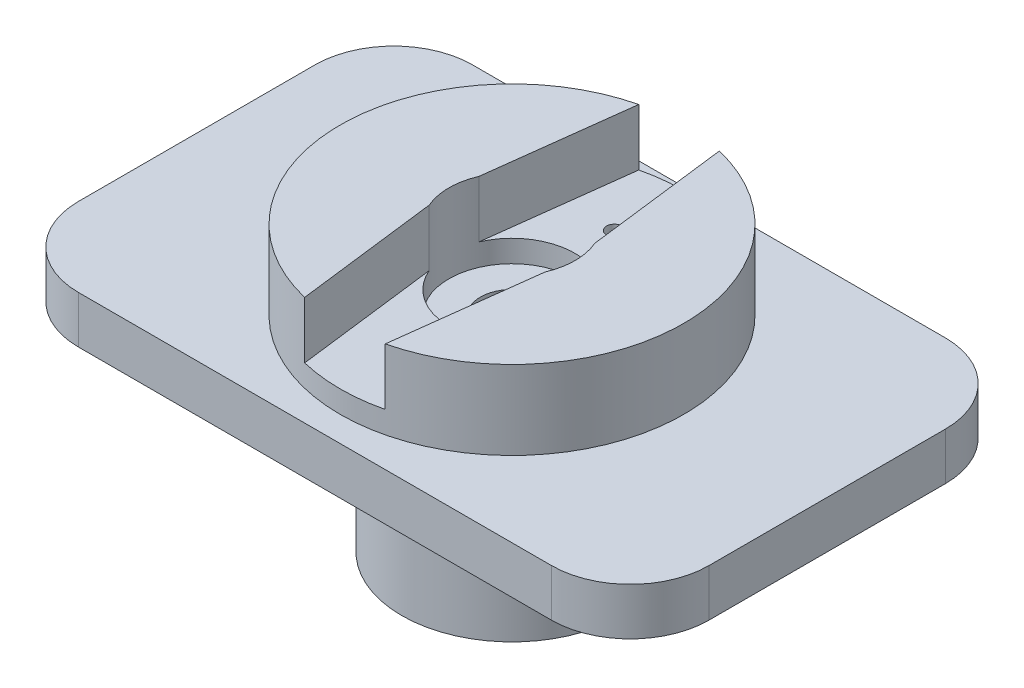
ISO-10303-21;
HEADER;
FILE_DESCRIPTION(('STEP AP214'),'2;1');
FILE_NAME('part.step','',(''),(''),'','','');
FILE_SCHEMA(('AUTOMOTIVE_DESIGN { 1 0 10303 214 1 1 1 1 }'));
ENDSEC;
DATA;
#1=APPLICATION_CONTEXT('core data for automotive mechanical design processes');
#2=APPLICATION_PROTOCOL_DEFINITION('international standard','automotive_design',2000,#1);
#3=PRODUCT_CONTEXT('',#1,'mechanical');
#4=PRODUCT('Part','Part','',(#3));
#5=PRODUCT_RELATED_PRODUCT_CATEGORY('part','',(#4));
#6=PRODUCT_DEFINITION_FORMATION('','',#4);
#7=PRODUCT_DEFINITION_CONTEXT('part definition',#1,'design');
#8=PRODUCT_DEFINITION('design','',#6,#7);
#9=PRODUCT_DEFINITION_SHAPE('','',#8);
#10=(LENGTH_UNIT() NAMED_UNIT(*) SI_UNIT(.MILLI.,.METRE.));
#11=(NAMED_UNIT(*) PLANE_ANGLE_UNIT() SI_UNIT($,.RADIAN.));
#12=(NAMED_UNIT(*) SI_UNIT($,.STERADIAN.) SOLID_ANGLE_UNIT());
#13=UNCERTAINTY_MEASURE_WITH_UNIT(LENGTH_MEASURE(1.E-05),#10,'distance_accuracy_value','');
#14=(GEOMETRIC_REPRESENTATION_CONTEXT(3) GLOBAL_UNCERTAINTY_ASSIGNED_CONTEXT((#13)) GLOBAL_UNIT_ASSIGNED_CONTEXT((#10,
#11,#12)) REPRESENTATION_CONTEXT('',''));
#15=CARTESIAN_POINT('',(0.,0.,0.));
#16=DIRECTION('',(0.,0.,1.));
#17=DIRECTION('',(1.,0.,0.));
#18=AXIS2_PLACEMENT_3D('',#15,#16,#17);
#19=CARTESIAN_POINT('',(15.,3.,-7.5));
#20=DIRECTION('',(0.,1.,0.));
#21=DIRECTION('',(0.,0.,1.));
#22=AXIS2_PLACEMENT_3D('',#19,#20,#21);
#23=CYLINDRICAL_SURFACE('',#22,5.);
#24=DIRECTION('',(0.,1.,0.));
#25=VECTOR('',#24,1.);
#26=CARTESIAN_POINT('',(20.,3.,-7.5));
#27=LINE('',#26,#25);
#28=CARTESIAN_POINT('',(20.,0.,-7.5));
#29=VERTEX_POINT('',#28);
#30=CARTESIAN_POINT('',(20.,3.,-7.5));
#31=VERTEX_POINT('',#30);
#32=EDGE_CURVE('E272',#29,#31,#27,.T.);
#33=ORIENTED_EDGE('',*,*,#32,.F.);
#34=CARTESIAN_POINT('',(15.,0.,-7.5));
#35=DIRECTION('',(0.,1.,0.));
#36=DIRECTION('',(0.,0.,1.));
#37=AXIS2_PLACEMENT_3D('',#34,#35,#36);
#38=CIRCLE('',#37,5.);
#39=CARTESIAN_POINT('',(15.,0.,-12.5));
#40=VERTEX_POINT('',#39);
#41=EDGE_CURVE('E59',#40,#29,#38,.F.);
#42=ORIENTED_EDGE('',*,*,#41,.F.);
#43=DIRECTION('',(0.,1.,0.));
#44=VECTOR('',#43,1.);
#45=CARTESIAN_POINT('',(15.,3.,-12.5));
#46=LINE('',#45,#44);
#47=CARTESIAN_POINT('',(15.,3.,-12.5));
#48=VERTEX_POINT('',#47);
#49=EDGE_CURVE('E275',#48,#40,#46,.F.);
#50=ORIENTED_EDGE('',*,*,#49,.F.);
#51=CARTESIAN_POINT('',(15.,3.,-7.5));
#52=DIRECTION('',(0.,1.,0.));
#53=DIRECTION('',(0.,0.,1.));
#54=AXIS2_PLACEMENT_3D('',#51,#52,#53);
#55=CIRCLE('',#54,5.);
#56=EDGE_CURVE('E46',#31,#48,#55,.T.);
#57=ORIENTED_EDGE('',*,*,#56,.F.);
#58=EDGE_LOOP('',(#33,#42,#50,#57));
#59=FACE_BOUND('',#58,.T.);
#60=ADVANCED_FACE('F39',(#59),#23,.T.);
#61=CARTESIAN_POINT('',(-15.,3.,-7.5));
#62=DIRECTION('',(0.,-1.,0.));
#63=DIRECTION('',(0.,0.,-1.));
#64=AXIS2_PLACEMENT_3D('',#61,#62,#63);
#65=CYLINDRICAL_SURFACE('',#64,5.);
#66=DIRECTION('',(0.,-1.,0.));
#67=VECTOR('',#66,1.);
#68=CARTESIAN_POINT('',(-20.,3.,-7.5));
#69=LINE('',#68,#67);
#70=CARTESIAN_POINT('',(-20.,3.,-7.5));
#71=VERTEX_POINT('',#70);
#72=CARTESIAN_POINT('',(-20.,0.,-7.5));
#73=VERTEX_POINT('',#72);
#74=EDGE_CURVE('E261',#71,#73,#69,.T.);
#75=ORIENTED_EDGE('',*,*,#74,.F.);
#76=CARTESIAN_POINT('',(-15.,3.,-7.5));
#77=DIRECTION('',(0.,1.,0.));
#78=DIRECTION('',(0.,0.,1.));
#79=AXIS2_PLACEMENT_3D('',#76,#77,#78);
#80=CIRCLE('',#79,5.);
#81=CARTESIAN_POINT('',(-15.,3.,-12.5));
#82=VERTEX_POINT('',#81);
#83=EDGE_CURVE('E267',#82,#71,#80,.T.);
#84=ORIENTED_EDGE('',*,*,#83,.F.);
#85=DIRECTION('',(0.,-1.,0.));
#86=VECTOR('',#85,1.);
#87=CARTESIAN_POINT('',(-15.,3.,-12.5));
#88=LINE('',#87,#86);
#89=CARTESIAN_POINT('',(-15.,0.,-12.5));
#90=VERTEX_POINT('',#89);
#91=EDGE_CURVE('E264',#90,#82,#88,.F.);
#92=ORIENTED_EDGE('',*,*,#91,.F.);
#93=CARTESIAN_POINT('',(-15.,0.,-7.5));
#94=DIRECTION('',(0.,1.,0.));
#95=DIRECTION('',(0.,0.,1.));
#96=AXIS2_PLACEMENT_3D('',#93,#94,#95);
#97=CIRCLE('',#96,5.);
#98=EDGE_CURVE('E269',#73,#90,#97,.F.);
#99=ORIENTED_EDGE('',*,*,#98,.F.);
#100=EDGE_LOOP('',(#75,#84,#92,#99));
#101=FACE_BOUND('',#100,.T.);
#102=ADVANCED_FACE('F306',(#101),#65,.T.);
#103=CARTESIAN_POINT('',(-15.,3.,7.5));
#104=DIRECTION('',(0.,-1.,0.));
#105=DIRECTION('',(0.,0.,-1.));
#106=AXIS2_PLACEMENT_3D('',#103,#104,#105);
#107=CYLINDRICAL_SURFACE('',#106,5.);
#108=DIRECTION('',(0.,-1.,0.));
#109=VECTOR('',#108,1.);
#110=CARTESIAN_POINT('',(-15.,3.,12.5));
#111=LINE('',#110,#109);
#112=CARTESIAN_POINT('',(-15.,3.,12.5));
#113=VERTEX_POINT('',#112);
#114=CARTESIAN_POINT('',(-15.,0.,12.5));
#115=VERTEX_POINT('',#114);
#116=EDGE_CURVE('E250',#113,#115,#111,.T.);
#117=ORIENTED_EDGE('',*,*,#116,.F.);
#118=CARTESIAN_POINT('',(-15.,3.,7.5));
#119=DIRECTION('',(0.,1.,0.));
#120=DIRECTION('',(0.,0.,1.));
#121=AXIS2_PLACEMENT_3D('',#118,#119,#120);
#122=CIRCLE('',#121,5.);
#123=CARTESIAN_POINT('',(-20.,3.,7.5));
#124=VERTEX_POINT('',#123);
#125=EDGE_CURVE('E256',#124,#113,#122,.T.);
#126=ORIENTED_EDGE('',*,*,#125,.F.);
#127=DIRECTION('',(0.,-1.,0.));
#128=VECTOR('',#127,1.);
#129=CARTESIAN_POINT('',(-20.,3.,7.5));
#130=LINE('',#129,#128);
#131=CARTESIAN_POINT('',(-20.,0.,7.5));
#132=VERTEX_POINT('',#131);
#133=EDGE_CURVE('E253',#132,#124,#130,.F.);
#134=ORIENTED_EDGE('',*,*,#133,.F.);
#135=CARTESIAN_POINT('',(-15.,0.,7.5));
#136=DIRECTION('',(0.,1.,0.));
#137=DIRECTION('',(0.,0.,1.));
#138=AXIS2_PLACEMENT_3D('',#135,#136,#137);
#139=CIRCLE('',#138,5.);
#140=EDGE_CURVE('E258',#115,#132,#139,.F.);
#141=ORIENTED_EDGE('',*,*,#140,.F.);
#142=EDGE_LOOP('',(#117,#126,#134,#141));
#143=FACE_BOUND('',#142,.T.);
#144=ADVANCED_FACE('F298',(#143),#107,.T.);
#145=CARTESIAN_POINT('',(15.,3.,7.5));
#146=DIRECTION('',(0.,-1.,0.));
#147=DIRECTION('',(0.,0.,-1.));
#148=AXIS2_PLACEMENT_3D('',#145,#146,#147);
#149=CYLINDRICAL_SURFACE('',#148,5.);
#150=DIRECTION('',(0.,-1.,0.));
#151=VECTOR('',#150,1.);
#152=CARTESIAN_POINT('',(20.,3.,7.5));
#153=LINE('',#152,#151);
#154=CARTESIAN_POINT('',(20.,3.,7.5));
#155=VERTEX_POINT('',#154);
#156=CARTESIAN_POINT('',(20.,0.,7.5));
#157=VERTEX_POINT('',#156);
#158=EDGE_CURVE('E161',#155,#157,#153,.T.);
#159=ORIENTED_EDGE('',*,*,#158,.F.);
#160=CARTESIAN_POINT('',(15.,3.,7.5));
#161=DIRECTION('',(0.,1.,0.));
#162=DIRECTION('',(0.,0.,1.));
#163=AXIS2_PLACEMENT_3D('',#160,#161,#162);
#164=CIRCLE('',#163,5.);
#165=CARTESIAN_POINT('',(15.,3.,12.5));
#166=VERTEX_POINT('',#165);
#167=EDGE_CURVE('E245',#166,#155,#164,.T.);
#168=ORIENTED_EDGE('',*,*,#167,.F.);
#169=DIRECTION('',(0.,-1.,0.));
#170=VECTOR('',#169,1.);
#171=CARTESIAN_POINT('',(15.,3.,12.5));
#172=LINE('',#171,#170);
#173=CARTESIAN_POINT('',(15.,0.,12.5));
#174=VERTEX_POINT('',#173);
#175=EDGE_CURVE('E242',#174,#166,#172,.F.);
#176=ORIENTED_EDGE('',*,*,#175,.F.);
#177=CARTESIAN_POINT('',(15.,0.,7.5));
#178=DIRECTION('',(0.,1.,0.));
#179=DIRECTION('',(0.,0.,1.));
#180=AXIS2_PLACEMENT_3D('',#177,#178,#179);
#181=CIRCLE('',#180,5.);
#182=EDGE_CURVE('E247',#157,#174,#181,.F.);
#183=ORIENTED_EDGE('',*,*,#182,.F.);
#184=EDGE_LOOP('',(#159,#168,#176,#183));
#185=FACE_BOUND('',#184,.T.);
#186=ADVANCED_FACE('F287',(#185),#149,.T.);
#187=CARTESIAN_POINT('',(0.,8.,0.));
#188=DIRECTION('',(0.,1.,0.));
#189=DIRECTION('',(0.,0.,1.));
#190=AXIS2_PLACEMENT_3D('',#187,#188,#189);
#191=PLANE('',#190);
#192=DIRECTION('',(-0.123207360520907,0.,0.992380948181429));
#193=VECTOR('',#192,1.);
#194=CARTESIAN_POINT('',(-3.67480993884706,8.,-1.57980122589865));
#195=LINE('',#194,#193);
#196=CARTESIAN_POINT('',(-2.55539130799865,8.,-10.5962245759046));
#197=VERTEX_POINT('',#196);
#198=CARTESIAN_POINT('',(-3.67480993884706,8.,-1.57980122589865));
#199=VERTEX_POINT('',#198);
#200=EDGE_CURVE('E170',#197,#199,#195,.T.);
#201=ORIENTED_EDGE('',*,*,#200,.F.);
#202=CARTESIAN_POINT('',(0.,8.,0.));
#203=DIRECTION('',(0.,1.,0.));
#204=DIRECTION('',(0.,0.,1.));
#205=AXIS2_PLACEMENT_3D('',#202,#203,#204);
#206=CIRCLE('',#205,10.9);
#207=CARTESIAN_POINT('',(-2.55539130799865,8.,10.5962245759046));
#208=VERTEX_POINT('',#207);
#209=EDGE_CURVE('E220',#197,#208,#206,.T.);
#210=ORIENTED_EDGE('',*,*,#209,.T.);
#211=DIRECTION('',(0.123207360520907,0.,0.992380948181429));
#212=VECTOR('',#211,1.);
#213=CARTESIAN_POINT('',(-3.67480993884706,8.,1.57980122589865));
#214=LINE('',#213,#212);
#215=CARTESIAN_POINT('',(-3.67480993884706,8.,1.57980122589865));
#216=VERTEX_POINT('',#215);
#217=EDGE_CURVE('E188',#216,#208,#214,.T.);
#218=ORIENTED_EDGE('',*,*,#217,.F.);
#219=CARTESIAN_POINT('',(0.,8.,0.));
#220=DIRECTION('',(0.,-1.,0.));
#221=DIRECTION('',(0.,0.,-1.));
#222=AXIS2_PLACEMENT_3D('',#219,#220,#221);
#223=CIRCLE('',#222,4.);
#224=EDGE_CURVE('E212',#216,#199,#223,.T.);
#225=ORIENTED_EDGE('',*,*,#224,.T.);
#226=EDGE_LOOP('',(#201,#210,#218,#225));
#227=FACE_BOUND('',#226,.T.);
#228=ADVANCED_FACE('F335',(#227),#191,.T.);
#229=CARTESIAN_POINT('',(20.,3.,-12.5));
#230=DIRECTION('',(-1.,0.,0.));
#231=DIRECTION('',(0.,0.,1.));
#232=AXIS2_PLACEMENT_3D('',#229,#230,#231);
#233=PLANE('',#232);
#234=DIRECTION('',(0.,0.,-1.));
#235=VECTOR('',#234,1.);
#236=CARTESIAN_POINT('',(20.,0.,-12.5));
#237=LINE('',#236,#235);
#238=EDGE_CURVE('E219',#157,#29,#237,.T.);
#239=ORIENTED_EDGE('',*,*,#238,.T.);
#240=ORIENTED_EDGE('',*,*,#32,.T.);
#241=DIRECTION('',(0.,0.,-1.));
#242=VECTOR('',#241,1.);
#243=CARTESIAN_POINT('',(20.,3.,-12.5));
#244=LINE('',#243,#242);
#245=EDGE_CURVE('E223',#155,#31,#244,.T.);
#246=ORIENTED_EDGE('',*,*,#245,.F.);
#247=ORIENTED_EDGE('',*,*,#158,.T.);
#248=EDGE_LOOP('',(#239,#240,#246,#247));
#249=FACE_BOUND('',#248,.T.);
#250=ADVANCED_FACE('F283',(#249),#233,.F.);
#251=CARTESIAN_POINT('',(-20.,3.,-12.5));
#252=DIRECTION('',(0.,0.,1.));
#253=DIRECTION('',(1.,0.,0.));
#254=AXIS2_PLACEMENT_3D('',#251,#252,#253);
#255=PLANE('',#254);
#256=DIRECTION('',(-1.,0.,0.));
#257=VECTOR('',#256,1.);
#258=CARTESIAN_POINT('',(-20.,3.,-12.5));
#259=LINE('',#258,#257);
#260=EDGE_CURVE('E225',#48,#82,#259,.T.);
#261=ORIENTED_EDGE('',*,*,#260,.F.);
#262=ORIENTED_EDGE('',*,*,#49,.T.);
#263=DIRECTION('',(-1.,0.,0.));
#264=VECTOR('',#263,1.);
#265=CARTESIAN_POINT('',(-20.,0.,-12.5));
#266=LINE('',#265,#264);
#267=EDGE_CURVE('E234',#40,#90,#266,.T.);
#268=ORIENTED_EDGE('',*,*,#267,.T.);
#269=ORIENTED_EDGE('',*,*,#91,.T.);
#270=EDGE_LOOP('',(#261,#262,#268,#269));
#271=FACE_BOUND('',#270,.T.);
#272=ADVANCED_FACE('F309',(#271),#255,.F.);
#273=CARTESIAN_POINT('',(-20.,3.,-12.5));
#274=DIRECTION('',(1.,0.,0.));
#275=DIRECTION('',(0.,0.,-1.));
#276=AXIS2_PLACEMENT_3D('',#273,#274,#275);
#277=PLANE('',#276);
#278=DIRECTION('',(0.,0.,1.));
#279=VECTOR('',#278,1.);
#280=CARTESIAN_POINT('',(-20.,3.,-12.5));
#281=LINE('',#280,#279);
#282=EDGE_CURVE('E228',#71,#124,#281,.T.);
#283=ORIENTED_EDGE('',*,*,#282,.F.);
#284=ORIENTED_EDGE('',*,*,#74,.T.);
#285=DIRECTION('',(0.,0.,1.));
#286=VECTOR('',#285,1.);
#287=CARTESIAN_POINT('',(-20.,0.,-12.5));
#288=LINE('',#287,#286);
#289=EDGE_CURVE('E236',#73,#132,#288,.T.);
#290=ORIENTED_EDGE('',*,*,#289,.T.);
#291=ORIENTED_EDGE('',*,*,#133,.T.);
#292=EDGE_LOOP('',(#283,#284,#290,#291));
#293=FACE_BOUND('',#292,.T.);
#294=ADVANCED_FACE('F301',(#293),#277,.F.);
#295=CARTESIAN_POINT('',(-20.,3.,12.5));
#296=DIRECTION('',(0.,0.,-1.));
#297=DIRECTION('',(-1.,0.,0.));
#298=AXIS2_PLACEMENT_3D('',#295,#296,#297);
#299=PLANE('',#298);
#300=DIRECTION('',(1.,0.,0.));
#301=VECTOR('',#300,1.);
#302=CARTESIAN_POINT('',(-20.,3.,12.5));
#303=LINE('',#302,#301);
#304=EDGE_CURVE('E230',#113,#166,#303,.T.);
#305=ORIENTED_EDGE('',*,*,#304,.F.);
#306=ORIENTED_EDGE('',*,*,#116,.T.);
#307=DIRECTION('',(1.,0.,0.));
#308=VECTOR('',#307,1.);
#309=CARTESIAN_POINT('',(-20.,0.,12.5));
#310=LINE('',#309,#308);
#311=EDGE_CURVE('E226',#115,#174,#310,.T.);
#312=ORIENTED_EDGE('',*,*,#311,.T.);
#313=ORIENTED_EDGE('',*,*,#175,.T.);
#314=EDGE_LOOP('',(#305,#306,#312,#313));
#315=FACE_BOUND('',#314,.T.);
#316=ADVANCED_FACE('F294',(#315),#299,.F.);
#317=CARTESIAN_POINT('',(0.,3.,0.));
#318=DIRECTION('',(0.,1.,0.));
#319=DIRECTION('',(0.,0.,1.));
#320=AXIS2_PLACEMENT_3D('',#317,#318,#319);
#321=PLANE('',#320);
#322=CARTESIAN_POINT('',(0.,3.,0.));
#323=DIRECTION('',(0.,1.,0.));
#324=DIRECTION('',(0.,0.,1.));
#325=AXIS2_PLACEMENT_3D('',#322,#323,#324);
#326=CIRCLE('',#325,10.9);
#327=CARTESIAN_POINT('',(0.,3.,10.9));
#328=VERTEX_POINT('',#327);
#329=EDGE_CURVE('E215',#328,#328,#326,.T.);
#330=ORIENTED_EDGE('',*,*,#329,.F.);
#331=EDGE_LOOP('',(#330));
#332=FACE_BOUND('',#331,.T.);
#333=ORIENTED_EDGE('',*,*,#245,.T.);
#334=ORIENTED_EDGE('',*,*,#56,.T.);
#335=ORIENTED_EDGE('',*,*,#260,.T.);
#336=ORIENTED_EDGE('',*,*,#83,.T.);
#337=ORIENTED_EDGE('',*,*,#282,.T.);
#338=ORIENTED_EDGE('',*,*,#125,.T.);
#339=ORIENTED_EDGE('',*,*,#304,.T.);
#340=ORIENTED_EDGE('',*,*,#167,.T.);
#341=EDGE_LOOP('',(#333,#334,#335,#336,#337,#338,#339,#340));
#342=FACE_BOUND('',#341,.T.);
#343=ADVANCED_FACE('F310',(#332,#342),#321,.T.);
#344=CARTESIAN_POINT('',(0.,0.,0.));
#345=DIRECTION('',(0.,1.,0.));
#346=DIRECTION('',(0.,0.,1.));
#347=AXIS2_PLACEMENT_3D('',#344,#345,#346);
#348=PLANE('',#347);
#349=CARTESIAN_POINT('',(0.,0.,0.));
#350=DIRECTION('',(0.,1.,0.));
#351=DIRECTION('',(0.,0.,1.));
#352=AXIS2_PLACEMENT_3D('',#349,#350,#351);
#353=CIRCLE('',#352,7.);
#354=CARTESIAN_POINT('',(0.,0.,7.));
#355=VERTEX_POINT('',#354);
#356=EDGE_CURVE('E11',#355,#355,#353,.F.);
#357=ORIENTED_EDGE('',*,*,#356,.F.);
#358=EDGE_LOOP('',(#357));
#359=FACE_BOUND('',#358,.T.);
#360=ORIENTED_EDGE('',*,*,#267,.F.);
#361=ORIENTED_EDGE('',*,*,#41,.T.);
#362=ORIENTED_EDGE('',*,*,#238,.F.);
#363=ORIENTED_EDGE('',*,*,#182,.T.);
#364=ORIENTED_EDGE('',*,*,#311,.F.);
#365=ORIENTED_EDGE('',*,*,#140,.T.);
#366=ORIENTED_EDGE('',*,*,#289,.F.);
#367=ORIENTED_EDGE('',*,*,#98,.T.);
#368=EDGE_LOOP('',(#360,#361,#362,#363,#364,#365,#366,#367));
#369=FACE_BOUND('',#368,.T.);
#370=ADVANCED_FACE('F280',(#359,#369),#348,.F.);
#371=CARTESIAN_POINT('',(0.,8.,0.));
#372=DIRECTION('',(0.,-1.,0.));
#373=DIRECTION('',(0.,0.,-1.));
#374=AXIS2_PLACEMENT_3D('',#371,#372,#373);
#375=CYLINDRICAL_SURFACE('',#374,10.9);
#376=ORIENTED_EDGE('',*,*,#209,.F.);
#377=DIRECTION('',(0.,-1.,0.));
#378=VECTOR('',#377,1.);
#379=CARTESIAN_POINT('',(-2.55539130799865,8.,-10.5962245759046));
#380=LINE('',#379,#378);
#381=CARTESIAN_POINT('',(-2.55539130799864,4.4,-10.5962245759046));
#382=VERTEX_POINT('',#381);
#383=EDGE_CURVE('E185',#197,#382,#380,.T.);
#384=ORIENTED_EDGE('',*,*,#383,.T.);
#385=CARTESIAN_POINT('',(0.,4.4,0.));
#386=DIRECTION('',(0.,-1.,0.));
#387=DIRECTION('',(0.,0.,-1.));
#388=AXIS2_PLACEMENT_3D('',#385,#386,#387);
#389=CIRCLE('',#388,10.9);
#390=CARTESIAN_POINT('',(2.55539130799872,4.4,-10.5962245759046));
#391=VERTEX_POINT('',#390);
#392=EDGE_CURVE('E178',#382,#391,#389,.T.);
#393=ORIENTED_EDGE('',*,*,#392,.T.);
#394=DIRECTION('',(0.,-1.,0.));
#395=VECTOR('',#394,1.);
#396=CARTESIAN_POINT('',(2.55539130799872,8.,-10.5962245759046));
#397=LINE('',#396,#395);
#398=CARTESIAN_POINT('',(2.55539130799872,8.,-10.5962245759046));
#399=VERTEX_POINT('',#398);
#400=EDGE_CURVE('E169',#391,#399,#397,.F.);
#401=ORIENTED_EDGE('',*,*,#400,.T.);
#402=CARTESIAN_POINT('',(2.55539130799872,8.,10.5962245759046));
#403=VERTEX_POINT('',#402);
#404=EDGE_CURVE('E216',#403,#399,#206,.T.);
#405=ORIENTED_EDGE('',*,*,#404,.F.);
#406=DIRECTION('',(0.,-1.,0.));
#407=VECTOR('',#406,1.);
#408=CARTESIAN_POINT('',(2.55539130799872,8.,10.5962245759046));
#409=LINE('',#408,#407);
#410=CARTESIAN_POINT('',(2.55539130799872,4.4,10.5962245759046));
#411=VERTEX_POINT('',#410);
#412=EDGE_CURVE('E209',#403,#411,#409,.T.);
#413=ORIENTED_EDGE('',*,*,#412,.T.);
#414=CARTESIAN_POINT('',(0.,4.4,0.));
#415=DIRECTION('',(0.,1.,0.));
#416=DIRECTION('',(0.,0.,1.));
#417=AXIS2_PLACEMENT_3D('',#414,#415,#416);
#418=CIRCLE('',#417,10.9);
#419=CARTESIAN_POINT('',(-2.55539130799864,4.4,10.5962245759046));
#420=VERTEX_POINT('',#419);
#421=EDGE_CURVE('E203',#420,#411,#418,.T.);
#422=ORIENTED_EDGE('',*,*,#421,.F.);
#423=DIRECTION('',(0.,-1.,0.));
#424=VECTOR('',#423,1.);
#425=CARTESIAN_POINT('',(-2.55539130799865,8.,10.5962245759046));
#426=LINE('',#425,#424);
#427=EDGE_CURVE('E206',#420,#208,#426,.F.);
#428=ORIENTED_EDGE('',*,*,#427,.T.);
#429=EDGE_LOOP('',(#376,#384,#393,#401,#405,#413,#422,#428));
#430=FACE_BOUND('',#429,.T.);
#431=ORIENTED_EDGE('',*,*,#329,.T.);
#432=EDGE_LOOP('',(#431));
#433=FACE_BOUND('',#432,.T.);
#434=ADVANCED_FACE('F318',(#430,#433),#375,.T.);
#435=DIRECTION('',(-0.123207360520899,0.,-0.99238094818143));
#436=VECTOR('',#435,1.);
#437=CARTESIAN_POINT('',(3.67480993884706,8.,-1.57980122589865));
#438=LINE('',#437,#436);
#439=CARTESIAN_POINT('',(3.67480993884706,8.,-1.57980122589865));
#440=VERTEX_POINT('',#439);
#441=EDGE_CURVE('E651',#440,#399,#438,.T.);
#442=ORIENTED_EDGE('',*,*,#441,.F.);
#443=CARTESIAN_POINT('',(3.67480993884706,8.,1.57980122589865));
#444=VERTEX_POINT('',#443);
#445=EDGE_CURVE('E175',#440,#444,#223,.T.);
#446=ORIENTED_EDGE('',*,*,#445,.T.);
#447=DIRECTION('',(0.123207360520899,0.,-0.99238094818143));
#448=VECTOR('',#447,1.);
#449=CARTESIAN_POINT('',(3.67480993884706,8.,1.57980122589865));
#450=LINE('',#449,#448);
#451=EDGE_CURVE('E193',#403,#444,#450,.T.);
#452=ORIENTED_EDGE('',*,*,#451,.F.);
#453=ORIENTED_EDGE('',*,*,#404,.T.);
#454=EDGE_LOOP('',(#442,#446,#452,#453));
#455=FACE_BOUND('',#454,.T.);
#456=ADVANCED_FACE('F531',(#455),#191,.T.);
#457=CARTESIAN_POINT('',(0.,8.,0.));
#458=DIRECTION('',(0.,-1.,0.));
#459=DIRECTION('',(0.,0.,-1.));
#460=AXIS2_PLACEMENT_3D('',#457,#458,#459);
#461=CYLINDRICAL_SURFACE('',#460,4.);
#462=CARTESIAN_POINT('',(0.,3.,0.));
#463=DIRECTION('',(0.,1.,0.));
#464=DIRECTION('',(0.,0.,1.));
#465=AXIS2_PLACEMENT_3D('',#462,#463,#464);
#466=CIRCLE('',#465,4.);
#467=CARTESIAN_POINT('',(0.,3.,4.));
#468=VERTEX_POINT('',#467);
#469=EDGE_CURVE('E682',#468,#468,#466,.T.);
#470=ORIENTED_EDGE('',*,*,#469,.F.);
#471=EDGE_LOOP('',(#470));
#472=FACE_BOUND('',#471,.T.);
#473=CARTESIAN_POINT('',(0.,4.4,0.));
#474=DIRECTION('',(0.,-1.,0.));
#475=DIRECTION('',(0.,0.,-1.));
#476=AXIS2_PLACEMENT_3D('',#473,#474,#475);
#477=CIRCLE('',#476,4.);
#478=CARTESIAN_POINT('',(3.67480993884706,4.4,-1.57980122589865));
#479=VERTEX_POINT('',#478);
#480=CARTESIAN_POINT('',(-3.67480993884706,4.4,-1.57980122589865));
#481=VERTEX_POINT('',#480);
#482=EDGE_CURVE('E151',#479,#481,#477,.F.);
#483=ORIENTED_EDGE('',*,*,#482,.T.);
#484=DIRECTION('',(0.,1.,0.));
#485=VECTOR('',#484,1.);
#486=CARTESIAN_POINT('',(-3.67480993884706,4.4,-1.57980122589865));
#487=LINE('',#486,#485);
#488=EDGE_CURVE('E176',#481,#199,#487,.T.);
#489=ORIENTED_EDGE('',*,*,#488,.T.);
#490=ORIENTED_EDGE('',*,*,#224,.F.);
#491=DIRECTION('',(0.,1.,0.));
#492=VECTOR('',#491,1.);
#493=CARTESIAN_POINT('',(-3.67480993884706,4.4,1.57980122589865));
#494=LINE('',#493,#492);
#495=CARTESIAN_POINT('',(-3.67480993884706,4.4,1.57980122589865));
#496=VERTEX_POINT('',#495);
#497=EDGE_CURVE('E196',#496,#216,#494,.T.);
#498=ORIENTED_EDGE('',*,*,#497,.F.);
#499=CARTESIAN_POINT('',(0.,4.4,0.));
#500=DIRECTION('',(0.,1.,0.));
#501=DIRECTION('',(0.,0.,1.));
#502=AXIS2_PLACEMENT_3D('',#499,#500,#501);
#503=CIRCLE('',#502,4.);
#504=CARTESIAN_POINT('',(3.67480993884706,4.4,1.57980122589865));
#505=VERTEX_POINT('',#504);
#506=EDGE_CURVE('E162',#505,#496,#503,.F.);
#507=ORIENTED_EDGE('',*,*,#506,.F.);
#508=DIRECTION('',(0.,1.,0.));
#509=VECTOR('',#508,1.);
#510=CARTESIAN_POINT('',(3.67480993884706,4.4,1.57980122589865));
#511=LINE('',#510,#509);
#512=EDGE_CURVE('E201',#505,#444,#511,.T.);
#513=ORIENTED_EDGE('',*,*,#512,.T.);
#514=ORIENTED_EDGE('',*,*,#445,.F.);
#515=DIRECTION('',(0.,1.,0.));
#516=VECTOR('',#515,1.);
#517=CARTESIAN_POINT('',(3.67480993884706,4.4,-1.57980122589865));
#518=LINE('',#517,#516);
#519=EDGE_CURVE('E166',#479,#440,#518,.T.);
#520=ORIENTED_EDGE('',*,*,#519,.F.);
#521=EDGE_LOOP('',(#483,#489,#490,#498,#507,#513,#514,#520));
#522=FACE_BOUND('',#521,.T.);
#523=ADVANCED_FACE('F173',(#472,#522),#461,.F.);
#524=CARTESIAN_POINT('',(3.67480993884706,4.4,1.57980122589865));
#525=DIRECTION('',(0.99238094818143,0.,0.123207360520899));
#526=DIRECTION('',(0.123207360520899,0.,-0.99238094818143));
#527=AXIS2_PLACEMENT_3D('',#524,#525,#526);
#528=PLANE('',#527);
#529=ORIENTED_EDGE('',*,*,#451,.T.);
#530=ORIENTED_EDGE('',*,*,#512,.F.);
#531=DIRECTION('',(0.123207360520899,0.,-0.99238094818143));
#532=VECTOR('',#531,1.);
#533=CARTESIAN_POINT('',(3.67480993884706,4.4,1.57980122589865));
#534=LINE('',#533,#532);
#535=EDGE_CURVE('E192',#411,#505,#534,.T.);
#536=ORIENTED_EDGE('',*,*,#535,.F.);
#537=ORIENTED_EDGE('',*,*,#412,.F.);
#538=EDGE_LOOP('',(#529,#530,#536,#537));
#539=FACE_BOUND('',#538,.T.);
#540=ADVANCED_FACE('F516',(#539),#528,.F.);
#541=CARTESIAN_POINT('',(-3.67480993884706,4.4,1.57980122589865));
#542=DIRECTION('',(-0.992380948181429,0.,0.123207360520907));
#543=DIRECTION('',(0.123207360520907,0.,0.992380948181429));
#544=AXIS2_PLACEMENT_3D('',#541,#542,#543);
#545=PLANE('',#544);
#546=DIRECTION('',(0.123207360520907,0.,0.992380948181429));
#547=VECTOR('',#546,1.);
#548=CARTESIAN_POINT('',(-3.67480993884706,4.4,1.57980122589865));
#549=LINE('',#548,#547);
#550=EDGE_CURVE('E189',#496,#420,#549,.T.);
#551=ORIENTED_EDGE('',*,*,#550,.F.);
#552=ORIENTED_EDGE('',*,*,#497,.T.);
#553=ORIENTED_EDGE('',*,*,#217,.T.);
#554=ORIENTED_EDGE('',*,*,#427,.F.);
#555=EDGE_LOOP('',(#551,#552,#553,#554));
#556=FACE_BOUND('',#555,.T.);
#557=ADVANCED_FACE('F509',(#556),#545,.F.);
#558=CARTESIAN_POINT('',(0.,4.4,0.));
#559=DIRECTION('',(0.,1.,0.));
#560=DIRECTION('',(0.,0.,1.));
#561=AXIS2_PLACEMENT_3D('',#558,#559,#560);
#562=PLANE('',#561);
#563=CARTESIAN_POINT('',(0.,4.4,6.5));
#564=DIRECTION('',(0.,1.,0.));
#565=DIRECTION('',(0.,0.,1.));
#566=AXIS2_PLACEMENT_3D('',#563,#564,#565);
#567=CIRCLE('',#566,0.5);
#568=CARTESIAN_POINT('',(0.,4.4,7.));
#569=VERTEX_POINT('',#568);
#570=EDGE_CURVE('E664',#569,#569,#567,.T.);
#571=ORIENTED_EDGE('',*,*,#570,.F.);
#572=EDGE_LOOP('',(#571));
#573=FACE_BOUND('',#572,.T.);
#574=ORIENTED_EDGE('',*,*,#421,.T.);
#575=ORIENTED_EDGE('',*,*,#535,.T.);
#576=ORIENTED_EDGE('',*,*,#506,.T.);
#577=ORIENTED_EDGE('',*,*,#550,.T.);
#578=EDGE_LOOP('',(#574,#575,#576,#577));
#579=FACE_BOUND('',#578,.T.);
#580=ADVANCED_FACE('F501',(#573,#579),#562,.T.);
#581=CARTESIAN_POINT('',(-3.67480993884706,4.4,-1.57980122589865));
#582=DIRECTION('',(-0.992380948181429,0.,-0.123207360520907));
#583=DIRECTION('',(-0.123207360520907,0.,0.992380948181429));
#584=AXIS2_PLACEMENT_3D('',#581,#582,#583);
#585=PLANE('',#584);
#586=ORIENTED_EDGE('',*,*,#200,.T.);
#587=ORIENTED_EDGE('',*,*,#488,.F.);
#588=DIRECTION('',(-0.123207360520907,0.,0.992380948181429));
#589=VECTOR('',#588,1.);
#590=CARTESIAN_POINT('',(-3.67480993884706,4.4,-1.57980122589865));
#591=LINE('',#590,#589);
#592=EDGE_CURVE('E157',#382,#481,#591,.T.);
#593=ORIENTED_EDGE('',*,*,#592,.F.);
#594=ORIENTED_EDGE('',*,*,#383,.F.);
#595=EDGE_LOOP('',(#586,#587,#593,#594));
#596=FACE_BOUND('',#595,.T.);
#597=ADVANCED_FACE('F494',(#596),#585,.F.);
#598=CARTESIAN_POINT('',(3.67480993884706,4.4,-1.57980122589865));
#599=DIRECTION('',(0.99238094818143,0.,-0.123207360520899));
#600=DIRECTION('',(-0.123207360520899,0.,-0.99238094818143));
#601=AXIS2_PLACEMENT_3D('',#598,#599,#600);
#602=PLANE('',#601);
#603=DIRECTION('',(-0.123207360520899,0.,-0.99238094818143));
#604=VECTOR('',#603,1.);
#605=CARTESIAN_POINT('',(3.67480993884706,4.4,-1.57980122589865));
#606=LINE('',#605,#604);
#607=EDGE_CURVE('E154',#479,#391,#606,.T.);
#608=ORIENTED_EDGE('',*,*,#607,.F.);
#609=ORIENTED_EDGE('',*,*,#519,.T.);
#610=ORIENTED_EDGE('',*,*,#441,.T.);
#611=ORIENTED_EDGE('',*,*,#400,.F.);
#612=EDGE_LOOP('',(#608,#609,#610,#611));
#613=FACE_BOUND('',#612,.T.);
#614=ADVANCED_FACE('F165',(#613),#602,.F.);
#615=CARTESIAN_POINT('',(0.,4.4,0.));
#616=DIRECTION('',(0.,-1.,0.));
#617=DIRECTION('',(0.,0.,-1.));
#618=AXIS2_PLACEMENT_3D('',#615,#616,#617);
#619=PLANE('',#618);
#620=CARTESIAN_POINT('',(0.,4.4,-6.5));
#621=DIRECTION('',(0.,1.,0.));
#622=DIRECTION('',(0.,0.,1.));
#623=AXIS2_PLACEMENT_3D('',#620,#621,#622);
#624=CIRCLE('',#623,0.5);
#625=CARTESIAN_POINT('',(0.,4.4,-6.));
#626=VERTEX_POINT('',#625);
#627=EDGE_CURVE('E670',#626,#626,#624,.T.);
#628=ORIENTED_EDGE('',*,*,#627,.F.);
#629=EDGE_LOOP('',(#628));
#630=FACE_BOUND('',#629,.T.);
#631=ORIENTED_EDGE('',*,*,#592,.T.);
#632=ORIENTED_EDGE('',*,*,#482,.F.);
#633=ORIENTED_EDGE('',*,*,#607,.T.);
#634=ORIENTED_EDGE('',*,*,#392,.F.);
#635=EDGE_LOOP('',(#631,#632,#633,#634));
#636=FACE_BOUND('',#635,.T.);
#637=ADVANCED_FACE('F153',(#630,#636),#619,.F.);
#638=CARTESIAN_POINT('',(0.,0.399999999999997,6.5));
#639=DIRECTION('',(0.,1.,0.));
#640=DIRECTION('',(0.,0.,1.));
#641=AXIS2_PLACEMENT_3D('',#638,#639,#640);
#642=CYLINDRICAL_SURFACE('',#641,0.5);
#643=CARTESIAN_POINT('',(0.,0.399999999999997,6.5));
#644=DIRECTION('',(0.,1.,0.));
#645=DIRECTION('',(0.,0.,1.));
#646=AXIS2_PLACEMENT_3D('',#643,#644,#645);
#647=CIRCLE('',#646,0.5);
#648=CARTESIAN_POINT('',(0.,0.399999999999997,7.));
#649=VERTEX_POINT('',#648);
#650=EDGE_CURVE('E661',#649,#649,#647,.T.);
#651=ORIENTED_EDGE('',*,*,#650,.F.);
#652=EDGE_LOOP('',(#651));
#653=FACE_BOUND('',#652,.T.);
#654=ORIENTED_EDGE('',*,*,#570,.T.);
#655=EDGE_LOOP('',(#654));
#656=FACE_BOUND('',#655,.T.);
#657=ADVANCED_FACE('F471',(#653,#656),#642,.F.);
#658=CARTESIAN_POINT('',(0.,0.399999999999997,6.5));
#659=DIRECTION('',(0.,1.,0.));
#660=DIRECTION('',(0.,0.,1.));
#661=AXIS2_PLACEMENT_3D('',#658,#659,#660);
#662=PLANE('',#661);
#663=ORIENTED_EDGE('',*,*,#650,.T.);
#664=EDGE_LOOP('',(#663));
#665=FACE_BOUND('',#664,.T.);
#666=ADVANCED_FACE('F463',(#665),#662,.T.);
#667=CARTESIAN_POINT('',(0.,0.399999999999997,-6.5));
#668=DIRECTION('',(0.,1.,0.));
#669=DIRECTION('',(0.,0.,1.));
#670=AXIS2_PLACEMENT_3D('',#667,#668,#669);
#671=CYLINDRICAL_SURFACE('',#670,0.5);
#672=CARTESIAN_POINT('',(0.,0.399999999999997,-6.5));
#673=DIRECTION('',(0.,1.,0.));
#674=DIRECTION('',(0.,0.,1.));
#675=AXIS2_PLACEMENT_3D('',#672,#673,#674);
#676=CIRCLE('',#675,0.5);
#677=CARTESIAN_POINT('',(0.,0.399999999999997,-6.));
#678=VERTEX_POINT('',#677);
#679=EDGE_CURVE('E668',#678,#678,#676,.T.);
#680=ORIENTED_EDGE('',*,*,#679,.F.);
#681=EDGE_LOOP('',(#680));
#682=FACE_BOUND('',#681,.T.);
#683=ORIENTED_EDGE('',*,*,#627,.T.);
#684=EDGE_LOOP('',(#683));
#685=FACE_BOUND('',#684,.T.);
#686=ADVANCED_FACE('F455',(#682,#685),#671,.F.);
#687=CARTESIAN_POINT('',(0.,0.399999999999997,-6.5));
#688=DIRECTION('',(0.,1.,0.));
#689=DIRECTION('',(0.,0.,1.));
#690=AXIS2_PLACEMENT_3D('',#687,#688,#689);
#691=PLANE('',#690);
#692=ORIENTED_EDGE('',*,*,#679,.T.);
#693=EDGE_LOOP('',(#692));
#694=FACE_BOUND('',#693,.T.);
#695=ADVANCED_FACE('F385',(#694),#691,.T.);
#696=CARTESIAN_POINT('',(0.,-10.,0.));
#697=DIRECTION('',(0.,-1.,0.));
#698=DIRECTION('',(0.,0.,-1.));
#699=AXIS2_PLACEMENT_3D('',#696,#697,#698);
#700=PLANE('',#699);
#701=CARTESIAN_POINT('',(0.,-10.,0.));
#702=DIRECTION('',(0.,-1.,0.));
#703=DIRECTION('',(0.,0.,-1.));
#704=AXIS2_PLACEMENT_3D('',#701,#702,#703);
#705=CIRCLE('',#704,7.);
#706=CARTESIAN_POINT('',(0.,-10.,-7.));
#707=VERTEX_POINT('',#706);
#708=EDGE_CURVE('E673',#707,#707,#705,.T.);
#709=ORIENTED_EDGE('',*,*,#708,.T.);
#710=EDGE_LOOP('',(#709));
#711=FACE_BOUND('',#710,.T.);
#712=CARTESIAN_POINT('',(0.,-10.,0.));
#713=DIRECTION('',(0.,-1.,0.));
#714=DIRECTION('',(0.,0.,-1.));
#715=AXIS2_PLACEMENT_3D('',#712,#713,#714);
#716=CIRCLE('',#715,3.);
#717=CARTESIAN_POINT('',(0.,-10.,-3.));
#718=VERTEX_POINT('',#717);
#719=EDGE_CURVE('E678',#718,#718,#716,.T.);
#720=ORIENTED_EDGE('',*,*,#719,.F.);
#721=EDGE_LOOP('',(#720));
#722=FACE_BOUND('',#721,.T.);
#723=ADVANCED_FACE('F378',(#711,#722),#700,.T.);
#724=CARTESIAN_POINT('',(0.,-10.,0.));
#725=DIRECTION('',(0.,1.,0.));
#726=DIRECTION('',(0.,0.,1.));
#727=AXIS2_PLACEMENT_3D('',#724,#725,#726);
#728=CYLINDRICAL_SURFACE('',#727,7.);
#729=ORIENTED_EDGE('',*,*,#708,.F.);
#730=EDGE_LOOP('',(#729));
#731=FACE_BOUND('',#730,.T.);
#732=ORIENTED_EDGE('',*,*,#356,.T.);
#733=EDGE_LOOP('',(#732));
#734=FACE_BOUND('',#733,.T.);
#735=ADVANCED_FACE('F384',(#731,#734),#728,.T.);
#736=CARTESIAN_POINT('',(0.,-10.,0.));
#737=DIRECTION('',(0.,1.,0.));
#738=DIRECTION('',(0.,0.,1.));
#739=AXIS2_PLACEMENT_3D('',#736,#737,#738);
#740=CYLINDRICAL_SURFACE('',#739,3.);
#741=ORIENTED_EDGE('',*,*,#719,.T.);
#742=EDGE_LOOP('',(#741));
#743=FACE_BOUND('',#742,.T.);
#744=CARTESIAN_POINT('',(0.,0.,0.));
#745=DIRECTION('',(0.,-1.,0.));
#746=DIRECTION('',(0.,0.,-1.));
#747=AXIS2_PLACEMENT_3D('',#744,#745,#746);
#748=CIRCLE('',#747,3.);
#749=CARTESIAN_POINT('',(0.,0.,-3.));
#750=VERTEX_POINT('',#749);
#751=EDGE_CURVE('E679',#750,#750,#748,.T.);
#752=ORIENTED_EDGE('',*,*,#751,.F.);
#753=EDGE_LOOP('',(#752));
#754=FACE_BOUND('',#753,.T.);
#755=ADVANCED_FACE('F397',(#743,#754),#740,.F.);
#756=CARTESIAN_POINT('',(0.,0.,0.));
#757=DIRECTION('',(0.,1.,0.));
#758=DIRECTION('',(0.,0.,1.));
#759=AXIS2_PLACEMENT_3D('',#756,#757,#758);
#760=PLANE('',#759);
#761=CARTESIAN_POINT('',(0.,0.,0.));
#762=DIRECTION('',(0.,1.,0.));
#763=DIRECTION('',(0.,0.,1.));
#764=AXIS2_PLACEMENT_3D('',#761,#762,#763);
#765=CIRCLE('',#764,2.);
#766=CARTESIAN_POINT('',(0.,0.,2.));
#767=VERTEX_POINT('',#766);
#768=EDGE_CURVE('E688',#767,#767,#765,.T.);
#769=ORIENTED_EDGE('',*,*,#768,.T.);
#770=EDGE_LOOP('',(#769));
#771=FACE_BOUND('',#770,.T.);
#772=ORIENTED_EDGE('',*,*,#751,.T.);
#773=EDGE_LOOP('',(#772));
#774=FACE_BOUND('',#773,.T.);
#775=ADVANCED_FACE('F408',(#771,#774),#760,.F.);
#776=CARTESIAN_POINT('',(0.,3.,0.));
#777=DIRECTION('',(0.,1.,0.));
#778=DIRECTION('',(0.,0.,1.));
#779=AXIS2_PLACEMENT_3D('',#776,#777,#778);
#780=PLANE('',#779);
#781=ORIENTED_EDGE('',*,*,#469,.T.);
#782=EDGE_LOOP('',(#781));
#783=FACE_BOUND('',#782,.T.);
#784=CARTESIAN_POINT('',(0.,3.,0.));
#785=DIRECTION('',(0.,1.,0.));
#786=DIRECTION('',(0.,0.,1.));
#787=AXIS2_PLACEMENT_3D('',#784,#785,#786);
#788=CIRCLE('',#787,2.);
#789=CARTESIAN_POINT('',(0.,3.,2.));
#790=VERTEX_POINT('',#789);
#791=EDGE_CURVE('E687',#790,#790,#788,.T.);
#792=ORIENTED_EDGE('',*,*,#791,.F.);
#793=EDGE_LOOP('',(#792));
#794=FACE_BOUND('',#793,.T.);
#795=ADVANCED_FACE('F420',(#783,#794),#780,.T.);
#796=CARTESIAN_POINT('',(0.,3.,0.));
#797=DIRECTION('',(0.,-1.,0.));
#798=DIRECTION('',(0.,0.,-1.));
#799=AXIS2_PLACEMENT_3D('',#796,#797,#798);
#800=CYLINDRICAL_SURFACE('',#799,2.);
#801=ORIENTED_EDGE('',*,*,#791,.T.);
#802=EDGE_LOOP('',(#801));
#803=FACE_BOUND('',#802,.T.);
#804=ORIENTED_EDGE('',*,*,#768,.F.);
#805=EDGE_LOOP('',(#804));
#806=FACE_BOUND('',#805,.T.);
#807=ADVANCED_FACE('F431',(#803,#806),#800,.F.);
#808=CLOSED_SHELL('',(#60,#102,#144,#186,#228,#250,#272,#294,#316,#343,#370,#434,#456,#523,#540,
#557,#580,#597,#614,#637,#657,#666,#686,#695,#723,#735,#755,#775,#795,#807));
#809=MANIFOLD_SOLID_BREP('B2',#808);
#810=ADVANCED_BREP_SHAPE_REPRESENTATION('',(#18,#809),#14);
#811=SHAPE_DEFINITION_REPRESENTATION(#9,#810);
ENDSEC;
END-ISO-10303-21;
